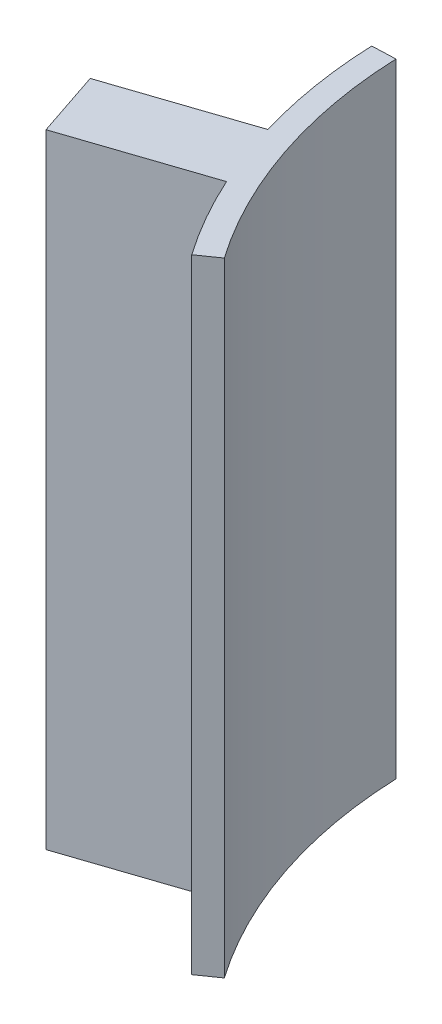
ISO-10303-21;
HEADER;
FILE_DESCRIPTION(('STEP AP214'),'2;1');
FILE_NAME('part.step','',(''),(''),'','','');
FILE_SCHEMA(('AUTOMOTIVE_DESIGN { 1 0 10303 214 1 1 1 1 }'));
ENDSEC;
DATA;
#1=APPLICATION_CONTEXT('core data for automotive mechanical design processes');
#2=APPLICATION_PROTOCOL_DEFINITION('international standard','automotive_design',2000,#1);
#3=PRODUCT_CONTEXT('',#1,'mechanical');
#4=PRODUCT('Part','Part','',(#3));
#5=PRODUCT_RELATED_PRODUCT_CATEGORY('part','',(#4));
#6=PRODUCT_DEFINITION_FORMATION('','',#4);
#7=PRODUCT_DEFINITION_CONTEXT('part definition',#1,'design');
#8=PRODUCT_DEFINITION('design','',#6,#7);
#9=PRODUCT_DEFINITION_SHAPE('','',#8);
#10=(LENGTH_UNIT() NAMED_UNIT(*) SI_UNIT(.MILLI.,.METRE.));
#11=(NAMED_UNIT(*) PLANE_ANGLE_UNIT() SI_UNIT($,.RADIAN.));
#12=(NAMED_UNIT(*) SI_UNIT($,.STERADIAN.) SOLID_ANGLE_UNIT());
#13=UNCERTAINTY_MEASURE_WITH_UNIT(LENGTH_MEASURE(1.E-05),#10,'distance_accuracy_value','');
#14=(GEOMETRIC_REPRESENTATION_CONTEXT(3) GLOBAL_UNCERTAINTY_ASSIGNED_CONTEXT((#13)) GLOBAL_UNIT_ASSIGNED_CONTEXT((#10,
#11,#12)) REPRESENTATION_CONTEXT('',''));
#15=CARTESIAN_POINT('',(0.,0.,0.));
#16=DIRECTION('',(0.,0.,1.));
#17=DIRECTION('',(1.,0.,0.));
#18=AXIS2_PLACEMENT_3D('',#15,#16,#17);
#19=CARTESIAN_POINT('',(2.10576385194429,80.,6.28143165208846));
#20=DIRECTION('',(-0.317851147463239,0.,-0.948140626730182));
#21=DIRECTION('',(-0.948140626730182,0.,0.317851147463239));
#22=AXIS2_PLACEMENT_3D('',#19,#20,#21);
#23=PLANE('',#22);
#24=DIRECTION('',(0.948140626730182,0.,-0.317851147463239));
#25=VECTOR('',#24,1.);
#26=CARTESIAN_POINT('',(2.10576385194429,0.,6.28143165208846));
#27=LINE('',#26,#25);
#28=CARTESIAN_POINT('',(-76.5487551518563,0.,32.6492809074729));
#29=VERTEX_POINT('',#28);
#30=CARTESIAN_POINT('',(-59.2024297639014,0.,26.8341631144019));
#31=VERTEX_POINT('',#30);
#32=EDGE_CURVE('E136',#29,#31,#27,.T.);
#33=ORIENTED_EDGE('',*,*,#32,.T.);
#34=DIRECTION('',(0.,-1.,0.));
#35=VECTOR('',#34,1.);
#36=CARTESIAN_POINT('',(-59.2024297639014,80.,26.8341631144019));
#37=LINE('',#36,#35);
#38=CARTESIAN_POINT('',(-59.2024297639014,80.,26.8341631144019));
#39=VERTEX_POINT('',#38);
#40=EDGE_CURVE('E11',#39,#31,#37,.T.);
#41=ORIENTED_EDGE('',*,*,#40,.F.);
#42=DIRECTION('',(0.948140626730182,0.,-0.317851147463239));
#43=VECTOR('',#42,1.);
#44=CARTESIAN_POINT('',(2.10576385194429,80.,6.28143165208846));
#45=LINE('',#44,#43);
#46=CARTESIAN_POINT('',(-76.5487551518563,80.,32.6492809074729));
#47=VERTEX_POINT('',#46);
#48=EDGE_CURVE('E154',#47,#39,#45,.T.);
#49=ORIENTED_EDGE('',*,*,#48,.F.);
#50=DIRECTION('',(0.,-1.,0.));
#51=VECTOR('',#50,1.);
#52=CARTESIAN_POINT('',(-76.5487551518563,80.,32.6492809074729));
#53=LINE('',#52,#51);
#54=EDGE_CURVE('E54',#47,#29,#53,.T.);
#55=ORIENTED_EDGE('',*,*,#54,.T.);
#56=EDGE_LOOP('',(#33,#41,#49,#55));
#57=FACE_BOUND('',#56,.T.);
#58=ADVANCED_FACE('F38',(#57),#23,.F.);
#59=CARTESIAN_POINT('',(0.,80.,0.));
#60=DIRECTION('',(0.,-1.,0.));
#61=DIRECTION('',(0.,0.,-1.));
#62=AXIS2_PLACEMENT_3D('',#59,#60,#61);
#63=CYLINDRICAL_SURFACE('',#62,65.);
#64=CARTESIAN_POINT('',(0.,0.,0.));
#65=DIRECTION('',(0.,1.,0.));
#66=DIRECTION('',(0.,0.,1.));
#67=AXIS2_PLACEMENT_3D('',#64,#65,#66);
#68=CIRCLE('',#67,65.);
#69=CARTESIAN_POINT('',(-53.3079109514605,0.,37.1922926154219));
#70=VERTEX_POINT('',#69);
#71=EDGE_CURVE('E138',#31,#70,#68,.T.);
#72=ORIENTED_EDGE('',*,*,#71,.T.);
#73=DIRECTION('',(0.,-1.,0.));
#74=VECTOR('',#73,1.);
#75=CARTESIAN_POINT('',(-53.3079109514605,80.,37.1922926154219));
#76=LINE('',#75,#74);
#77=CARTESIAN_POINT('',(-53.3079109514605,80.,37.1922926154219));
#78=VERTEX_POINT('',#77);
#79=EDGE_CURVE('E46',#78,#70,#76,.T.);
#80=ORIENTED_EDGE('',*,*,#79,.F.);
#81=CARTESIAN_POINT('',(0.,80.,0.));
#82=DIRECTION('',(0.,1.,0.));
#83=DIRECTION('',(0.,0.,1.));
#84=AXIS2_PLACEMENT_3D('',#81,#82,#83);
#85=CIRCLE('',#84,65.);
#86=EDGE_CURVE('E92',#39,#78,#85,.T.);
#87=ORIENTED_EDGE('',*,*,#86,.F.);
#88=ORIENTED_EDGE('',*,*,#40,.T.);
#89=EDGE_LOOP('',(#72,#80,#87,#88));
#90=FACE_BOUND('',#89,.T.);
#91=ADVANCED_FACE('F181',(#90),#63,.T.);
#92=CARTESIAN_POINT('',(0.,80.,0.));
#93=DIRECTION('',(-0.572189117160337,0.,-0.820121706945545));
#94=DIRECTION('',(-0.820121706945545,0.,0.572189117160337));
#95=AXIS2_PLACEMENT_3D('',#92,#93,#94);
#96=PLANE('',#95);
#97=DIRECTION('',(0.820121706945545,0.,-0.572189117160337));
#98=VECTOR('',#97,1.);
#99=CARTESIAN_POINT('',(0.,0.,0.));
#100=LINE('',#99,#98);
#101=CARTESIAN_POINT('',(-50.8475458306238,0.,35.4757252639409));
#102=VERTEX_POINT('',#101);
#103=EDGE_CURVE('E140',#70,#102,#100,.T.);
#104=ORIENTED_EDGE('',*,*,#103,.T.);
#105=DIRECTION('',(0.,-1.,0.));
#106=VECTOR('',#105,1.);
#107=CARTESIAN_POINT('',(-50.8475458306238,80.,35.4757252639409));
#108=LINE('',#107,#106);
#109=CARTESIAN_POINT('',(-50.8475458306238,80.,35.4757252639409));
#110=VERTEX_POINT('',#109);
#111=EDGE_CURVE('E160',#110,#102,#108,.T.);
#112=ORIENTED_EDGE('',*,*,#111,.F.);
#113=DIRECTION('',(0.820121706945545,0.,-0.572189117160337));
#114=VECTOR('',#113,1.);
#115=CARTESIAN_POINT('',(0.,80.,0.));
#116=LINE('',#115,#114);
#117=EDGE_CURVE('E167',#78,#110,#116,.T.);
#118=ORIENTED_EDGE('',*,*,#117,.F.);
#119=ORIENTED_EDGE('',*,*,#79,.T.);
#120=EDGE_LOOP('',(#104,#112,#118,#119));
#121=FACE_BOUND('',#120,.T.);
#122=ADVANCED_FACE('F165',(#121),#96,.F.);
#123=CARTESIAN_POINT('',(0.,80.,0.));
#124=DIRECTION('',(0.,-1.,0.));
#125=DIRECTION('',(0.,0.,-1.));
#126=AXIS2_PLACEMENT_3D('',#123,#124,#125);
#127=CYLINDRICAL_SURFACE('',#126,62.);
#128=CARTESIAN_POINT('',(0.,0.,0.));
#129=DIRECTION('',(0.,1.,0.));
#130=DIRECTION('',(0.,0.,1.));
#131=AXIS2_PLACEMENT_3D('',#128,#129,#130);
#132=CIRCLE('',#131,62.);
#133=CARTESIAN_POINT('',(-61.9558240045634,0.,2.34005810089497));
#134=VERTEX_POINT('',#133);
#135=EDGE_CURVE('E143',#134,#102,#132,.T.);
#136=ORIENTED_EDGE('',*,*,#135,.F.);
#137=DIRECTION('',(0.,-1.,0.));
#138=VECTOR('',#137,1.);
#139=CARTESIAN_POINT('',(-61.9558240045634,80.,2.34005810089497));
#140=LINE('',#139,#138);
#141=CARTESIAN_POINT('',(-61.9558240045634,80.,2.34005810089497));
#142=VERTEX_POINT('',#141);
#143=EDGE_CURVE('E158',#142,#134,#140,.T.);
#144=ORIENTED_EDGE('',*,*,#143,.F.);
#145=CARTESIAN_POINT('',(0.,80.,0.));
#146=DIRECTION('',(0.,1.,0.));
#147=DIRECTION('',(0.,0.,1.));
#148=AXIS2_PLACEMENT_3D('',#145,#146,#147);
#149=CIRCLE('',#148,62.);
#150=EDGE_CURVE('E175',#142,#110,#149,.T.);
#151=ORIENTED_EDGE('',*,*,#150,.T.);
#152=ORIENTED_EDGE('',*,*,#111,.T.);
#153=EDGE_LOOP('',(#136,#144,#151,#152));
#154=FACE_BOUND('',#153,.T.);
#155=ADVANCED_FACE('F173',(#154),#127,.F.);
#156=CARTESIAN_POINT('',(0.,80.,0.));
#157=DIRECTION('',(0.0377428725950801,0.,0.999287483944571));
#158=DIRECTION('',(0.999287483944571,0.,-0.0377428725950801));
#159=AXIS2_PLACEMENT_3D('',#156,#157,#158);
#160=PLANE('',#159);
#161=DIRECTION('',(-0.999287483944571,0.,0.0377428725950801));
#162=VECTOR('',#161,1.);
#163=CARTESIAN_POINT('',(0.,0.,0.));
#164=LINE('',#163,#162);
#165=CARTESIAN_POINT('',(-64.9536864563971,0.,2.45328671868021));
#166=VERTEX_POINT('',#165);
#167=EDGE_CURVE('E146',#134,#166,#164,.T.);
#168=ORIENTED_EDGE('',*,*,#167,.T.);
#169=DIRECTION('',(0.,-1.,0.));
#170=VECTOR('',#169,1.);
#171=CARTESIAN_POINT('',(-64.9536864563971,80.,2.45328671868021));
#172=LINE('',#171,#170);
#173=CARTESIAN_POINT('',(-64.9536864563971,80.,2.45328671868021));
#174=VERTEX_POINT('',#173);
#175=EDGE_CURVE('E128',#174,#166,#172,.T.);
#176=ORIENTED_EDGE('',*,*,#175,.F.);
#177=DIRECTION('',(-0.999287483944571,0.,0.0377428725950801));
#178=VECTOR('',#177,1.);
#179=CARTESIAN_POINT('',(0.,80.,0.));
#180=LINE('',#179,#178);
#181=EDGE_CURVE('E116',#142,#174,#180,.T.);
#182=ORIENTED_EDGE('',*,*,#181,.F.);
#183=ORIENTED_EDGE('',*,*,#143,.T.);
#184=EDGE_LOOP('',(#168,#176,#182,#183));
#185=FACE_BOUND('',#184,.T.);
#186=ADVANCED_FACE('F191',(#185),#160,.F.);
#187=CARTESIAN_POINT('',(0.,80.,0.));
#188=DIRECTION('',(0.,-1.,0.));
#189=DIRECTION('',(0.,0.,-1.));
#190=AXIS2_PLACEMENT_3D('',#187,#188,#189);
#191=CYLINDRICAL_SURFACE('',#190,65.);
#192=CARTESIAN_POINT('',(0.,0.,0.));
#193=DIRECTION('',(0.,1.,0.));
#194=DIRECTION('',(0.,0.,1.));
#195=AXIS2_PLACEMENT_3D('',#192,#193,#194);
#196=CIRCLE('',#195,65.);
#197=CARTESIAN_POINT('',(-62.3428841978822,0.,18.394694612563));
#198=VERTEX_POINT('',#197);
#199=EDGE_CURVE('E125',#166,#198,#196,.T.);
#200=ORIENTED_EDGE('',*,*,#199,.T.);
#201=DIRECTION('',(0.,-1.,0.));
#202=VECTOR('',#201,1.);
#203=CARTESIAN_POINT('',(-62.3428841978822,80.,18.394694612563));
#204=LINE('',#203,#202);
#205=CARTESIAN_POINT('',(-62.3428841978822,80.,18.394694612563));
#206=VERTEX_POINT('',#205);
#207=EDGE_CURVE('E122',#206,#198,#204,.T.);
#208=ORIENTED_EDGE('',*,*,#207,.F.);
#209=CARTESIAN_POINT('',(0.,80.,0.));
#210=DIRECTION('',(0.,1.,0.));
#211=DIRECTION('',(0.,0.,1.));
#212=AXIS2_PLACEMENT_3D('',#209,#210,#211);
#213=CIRCLE('',#212,65.);
#214=EDGE_CURVE('E108',#174,#206,#213,.T.);
#215=ORIENTED_EDGE('',*,*,#214,.F.);
#216=ORIENTED_EDGE('',*,*,#175,.T.);
#217=EDGE_LOOP('',(#200,#208,#215,#216));
#218=FACE_BOUND('',#217,.T.);
#219=ADVANCED_FACE('F123',(#218),#191,.T.);
#220=CARTESIAN_POINT('',(-0.754896475224843,80.,-2.25183398848314));
#221=DIRECTION('',(-0.317851147463239,0.,-0.948140626730182));
#222=DIRECTION('',(-0.948140626730182,0.,0.317851147463239));
#223=AXIS2_PLACEMENT_3D('',#220,#221,#222);
#224=PLANE('',#223);
#225=DIRECTION('',(0.948140626730182,0.,-0.317851147463239));
#226=VECTOR('',#225,1.);
#227=CARTESIAN_POINT('',(-0.754896475224843,0.,-2.25183398848314));
#228=LINE('',#227,#226);
#229=CARTESIAN_POINT('',(-79.4094154790254,0.,24.1160152669012));
#230=VERTEX_POINT('',#229);
#231=EDGE_CURVE('E149',#230,#198,#228,.T.);
#232=ORIENTED_EDGE('',*,*,#231,.F.);
#233=DIRECTION('',(0.,-1.,0.));
#234=VECTOR('',#233,1.);
#235=CARTESIAN_POINT('',(-79.4094154790254,80.,24.1160152669012));
#236=LINE('',#235,#234);
#237=CARTESIAN_POINT('',(-79.4094154790254,80.,24.1160152669012));
#238=VERTEX_POINT('',#237);
#239=EDGE_CURVE('E80',#238,#230,#236,.T.);
#240=ORIENTED_EDGE('',*,*,#239,.F.);
#241=DIRECTION('',(0.948140626730182,0.,-0.317851147463239));
#242=VECTOR('',#241,1.);
#243=CARTESIAN_POINT('',(-0.754896475224843,80.,-2.25183398848314));
#244=LINE('',#243,#242);
#245=EDGE_CURVE('E113',#238,#206,#244,.T.);
#246=ORIENTED_EDGE('',*,*,#245,.T.);
#247=ORIENTED_EDGE('',*,*,#207,.T.);
#248=EDGE_LOOP('',(#232,#240,#246,#247));
#249=FACE_BOUND('',#248,.T.);
#250=ADVANCED_FACE('F130',(#249),#224,.T.);
#251=CARTESIAN_POINT('',(-78.6545190038006,80.,26.3678492553844));
#252=DIRECTION('',(-0.948140626730182,0.,0.317851147463239));
#253=DIRECTION('',(0.317851147463239,0.,0.948140626730182));
#254=AXIS2_PLACEMENT_3D('',#251,#252,#253);
#255=PLANE('',#254);
#256=DIRECTION('',(-0.317851147463239,0.,-0.948140626730182));
#257=VECTOR('',#256,1.);
#258=CARTESIAN_POINT('',(-78.6545190038006,0.,26.3678492553844));
#259=LINE('',#258,#257);
#260=EDGE_CURVE('E151',#29,#230,#259,.T.);
#261=ORIENTED_EDGE('',*,*,#260,.F.);
#262=ORIENTED_EDGE('',*,*,#54,.F.);
#263=DIRECTION('',(-0.317851147463239,0.,-0.948140626730182));
#264=VECTOR('',#263,1.);
#265=CARTESIAN_POINT('',(-78.6545190038006,80.,26.3678492553844));
#266=LINE('',#265,#264);
#267=EDGE_CURVE('E131',#47,#238,#266,.T.);
#268=ORIENTED_EDGE('',*,*,#267,.T.);
#269=ORIENTED_EDGE('',*,*,#239,.T.);
#270=EDGE_LOOP('',(#261,#262,#268,#269));
#271=FACE_BOUND('',#270,.T.);
#272=ADVANCED_FACE('F199',(#271),#255,.T.);
#273=CARTESIAN_POINT('',(0.,80.,0.));
#274=DIRECTION('',(0.,1.,0.));
#275=DIRECTION('',(0.,0.,1.));
#276=AXIS2_PLACEMENT_3D('',#273,#274,#275);
#277=PLANE('',#276);
#278=ORIENTED_EDGE('',*,*,#48,.T.);
#279=ORIENTED_EDGE('',*,*,#86,.T.);
#280=ORIENTED_EDGE('',*,*,#117,.T.);
#281=ORIENTED_EDGE('',*,*,#150,.F.);
#282=ORIENTED_EDGE('',*,*,#181,.T.);
#283=ORIENTED_EDGE('',*,*,#214,.T.);
#284=ORIENTED_EDGE('',*,*,#245,.F.);
#285=ORIENTED_EDGE('',*,*,#267,.F.);
#286=EDGE_LOOP('',(#278,#279,#280,#281,#282,#283,#284,#285));
#287=FACE_BOUND('',#286,.T.);
#288=ADVANCED_FACE('F110',(#287),#277,.T.);
#289=CARTESIAN_POINT('',(0.,0.,0.));
#290=DIRECTION('',(0.,1.,0.));
#291=DIRECTION('',(0.,0.,1.));
#292=AXIS2_PLACEMENT_3D('',#289,#290,#291);
#293=PLANE('',#292);
#294=ORIENTED_EDGE('',*,*,#32,.F.);
#295=ORIENTED_EDGE('',*,*,#260,.T.);
#296=ORIENTED_EDGE('',*,*,#231,.T.);
#297=ORIENTED_EDGE('',*,*,#199,.F.);
#298=ORIENTED_EDGE('',*,*,#167,.F.);
#299=ORIENTED_EDGE('',*,*,#135,.T.);
#300=ORIENTED_EDGE('',*,*,#103,.F.);
#301=ORIENTED_EDGE('',*,*,#71,.F.);
#302=EDGE_LOOP('',(#294,#295,#296,#297,#298,#299,#300,#301));
#303=FACE_BOUND('',#302,.T.);
#304=ADVANCED_FACE('F169',(#303),#293,.F.);
#305=CLOSED_SHELL('',(#58,#91,#122,#155,#186,#219,#250,#272,#288,#304));
#306=MANIFOLD_SOLID_BREP('B2',#305);
#307=ADVANCED_BREP_SHAPE_REPRESENTATION('',(#18,#306),#14);
#308=SHAPE_DEFINITION_REPRESENTATION(#9,#307);
ENDSEC;
END-ISO-10303-21;
